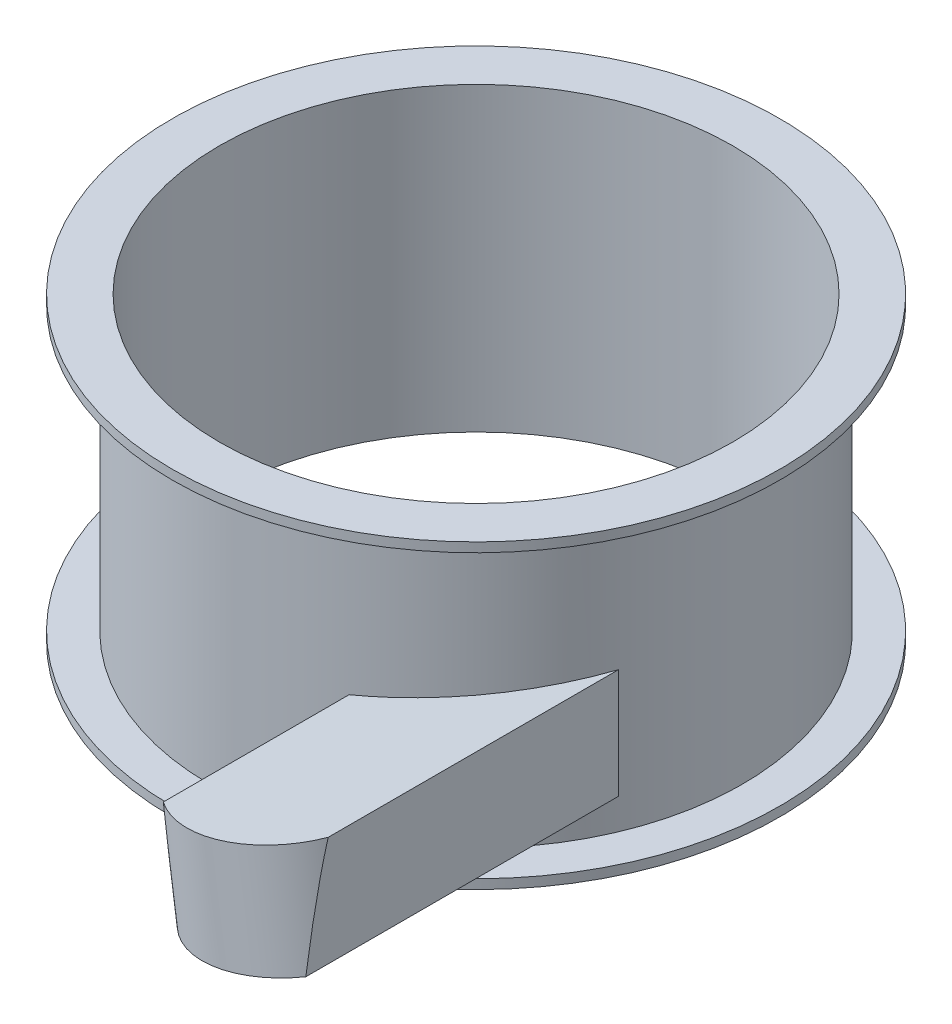
ISO-10303-21;
HEADER;
FILE_DESCRIPTION(('STEP AP214'),'2;1');
FILE_NAME('part.step','',(''),(''),'','','');
FILE_SCHEMA(('AUTOMOTIVE_DESIGN { 1 0 10303 214 1 1 1 1 }'));
ENDSEC;
DATA;
#1=APPLICATION_CONTEXT('core data for automotive mechanical design processes');
#2=APPLICATION_PROTOCOL_DEFINITION('international standard','automotive_design',2000,#1);
#3=PRODUCT_CONTEXT('',#1,'mechanical');
#4=PRODUCT('Part','Part','',(#3));
#5=PRODUCT_RELATED_PRODUCT_CATEGORY('part','',(#4));
#6=PRODUCT_DEFINITION_FORMATION('','',#4);
#7=PRODUCT_DEFINITION_CONTEXT('part definition',#1,'design');
#8=PRODUCT_DEFINITION('design','',#6,#7);
#9=PRODUCT_DEFINITION_SHAPE('','',#8);
#10=(LENGTH_UNIT() NAMED_UNIT(*) SI_UNIT(.MILLI.,.METRE.));
#11=(NAMED_UNIT(*) PLANE_ANGLE_UNIT() SI_UNIT($,.RADIAN.));
#12=(NAMED_UNIT(*) SI_UNIT($,.STERADIAN.) SOLID_ANGLE_UNIT());
#13=UNCERTAINTY_MEASURE_WITH_UNIT(LENGTH_MEASURE(1.E-05),#10,'distance_accuracy_value','');
#14=(GEOMETRIC_REPRESENTATION_CONTEXT(3) GLOBAL_UNCERTAINTY_ASSIGNED_CONTEXT((#13)) GLOBAL_UNIT_ASSIGNED_CONTEXT((#10,
#11,#12)) REPRESENTATION_CONTEXT('',''));
#15=CARTESIAN_POINT('',(0.,0.,0.));
#16=DIRECTION('',(0.,0.,1.));
#17=DIRECTION('',(1.,0.,0.));
#18=AXIS2_PLACEMENT_3D('',#15,#16,#17);
#19=CARTESIAN_POINT('',(271.787755102041,74.6313325330143,241.));
#20=DIRECTION('',(-1.,0.,0.));
#21=DIRECTION('',(0.,0.,1.));
#22=AXIS2_PLACEMENT_3D('',#19,#20,#21);
#23=PLANE('',#22);
#24=DIRECTION('',(0.,0.,-1.));
#25=VECTOR('',#24,1.);
#26=CARTESIAN_POINT('',(271.787755102041,74.6313325330143,241.));
#27=LINE('',#26,#25);
#28=CARTESIAN_POINT('',(271.787755102041,74.6313325330142,208.968468170204));
#29=VERTEX_POINT('',#28);
#30=CARTESIAN_POINT('',(271.787755102041,74.6313325330143,54.7082564102552));
#31=VERTEX_POINT('',#30);
#32=EDGE_CURVE('E165',#29,#31,#27,.T.);
#33=ORIENTED_EDGE('',*,*,#32,.F.);
#34=CARTESIAN_POINT('',(271.787755102041,-228.764700180287,188.343327465142));
#35=DIRECTION('',(-1.,0.,0.));
#36=DIRECTION('',(0.,-1.,0.));
#37=AXIS2_PLACEMENT_3D('',#34,#35,#36);
#38=ELLIPSE('',#37,336.964397029181,47.4027571613106);
#39=CARTESIAN_POINT('',(271.787755102041,16.3749099639866,220.867019893133));
#40=VERTEX_POINT('',#39);
#41=EDGE_CURVE('E156',#29,#40,#38,.F.);
#42=ORIENTED_EDGE('',*,*,#41,.T.);
#43=DIRECTION('',(0.,0.,-1.));
#44=VECTOR('',#43,1.);
#45=CARTESIAN_POINT('',(271.787755102041,16.3749099639866,241.));
#46=LINE('',#45,#44);
#47=CARTESIAN_POINT('',(271.787755102041,16.3749099639866,54.7082564102552));
#48=VERTEX_POINT('',#47);
#49=EDGE_CURVE('E159',#40,#48,#46,.T.);
#50=ORIENTED_EDGE('',*,*,#49,.T.);
#51=DIRECTION('',(0.,1.,0.));
#52=VECTOR('',#51,1.);
#53=CARTESIAN_POINT('',(271.787755102041,150.,54.7082564102554));
#54=LINE('',#53,#52);
#55=EDGE_CURVE('E194',#31,#48,#54,.F.);
#56=ORIENTED_EDGE('',*,*,#55,.F.);
#57=EDGE_LOOP('',(#33,#42,#50,#56));
#58=FACE_BOUND('',#57,.T.);
#59=ADVANCED_FACE('F39',(#58),#23,.F.);
#60=CARTESIAN_POINT('',(271.787755102041,74.6313325330143,241.));
#61=DIRECTION('',(0.140675862433044,-0.990055706376525,0.));
#62=DIRECTION('',(0.990055706376525,0.140675862433044,0.));
#63=AXIS2_PLACEMENT_3D('',#60,#61,#62);
#64=PLANE('',#63);
#65=DIRECTION('',(0.,0.,-1.));
#66=VECTOR('',#65,1.);
#67=CARTESIAN_POINT('',(201.787755102041,64.6851140456193,241.));
#68=LINE('',#67,#66);
#69=CARTESIAN_POINT('',(201.787755102041,64.6851140456193,226.576240328998));
#70=VERTEX_POINT('',#69);
#71=CARTESIAN_POINT('',(201.787755102041,64.6851140456193,127.856478262683));
#72=VERTEX_POINT('',#71);
#73=EDGE_CURVE('E163',#70,#72,#68,.T.);
#74=ORIENTED_EDGE('',*,*,#73,.F.);
#75=CARTESIAN_POINT('',(229.531683951017,68.6272165889144,188.343327465142));
#76=DIRECTION('',(0.140675862433044,-0.990055706376525,0.));
#77=DIRECTION('',(0.990055706376525,0.140675862433044,0.));
#78=AXIS2_PLACEMENT_3D('',#75,#76,#77);
#79=CIRCLE('',#78,47.4027571613106);
#80=EDGE_CURVE('E153',#70,#29,#79,.F.);
#81=ORIENTED_EDGE('',*,*,#80,.T.);
#82=ORIENTED_EDGE('',*,*,#32,.T.);
#83=CARTESIAN_POINT('',(141.4,56.104688242645,0.));
#84=DIRECTION('',(0.140675862433044,-0.990055706376525,0.));
#85=DIRECTION('',(0.990055706376525,0.140675862433044,0.));
#86=AXIS2_PLACEMENT_3D('',#83,#84,#85);
#87=ELLIPSE('',#86,142.820246466237,141.4);
#88=EDGE_CURVE('E191',#72,#31,#87,.F.);
#89=ORIENTED_EDGE('',*,*,#88,.F.);
#90=EDGE_LOOP('',(#74,#81,#82,#89));
#91=FACE_BOUND('',#90,.T.);
#92=ADVANCED_FACE('F259',(#91),#64,.F.);
#93=CARTESIAN_POINT('',(201.787755102041,6.42869147659168,241.));
#94=DIRECTION('',(1.,0.,0.));
#95=DIRECTION('',(0.,0.,-1.));
#96=AXIS2_PLACEMENT_3D('',#93,#94,#95);
#97=PLANE('',#96);
#98=DIRECTION('',(0.,0.,-1.));
#99=VECTOR('',#98,1.);
#100=CARTESIAN_POINT('',(201.787755102041,6.42869147659168,241.));
#101=LINE('',#100,#99);
#102=CARTESIAN_POINT('',(201.787755102041,6.42869147659166,218.925798780769));
#103=VERTEX_POINT('',#102);
#104=CARTESIAN_POINT('',(201.787755102041,6.42869147659168,127.856478262683));
#105=VERTEX_POINT('',#104);
#106=EDGE_CURVE('E161',#103,#105,#101,.T.);
#107=ORIENTED_EDGE('',*,*,#106,.F.);
#108=CARTESIAN_POINT('',(201.787755102041,263.884843584498,188.343327465142));
#109=DIRECTION('',(1.,0.,0.));
#110=DIRECTION('',(0.,-1.,0.));
#111=AXIS2_PLACEMENT_3D('',#108,#109,#110);
#112=ELLIPSE('',#111,336.964397029181,47.4027571613106);
#113=EDGE_CURVE('E150',#103,#70,#112,.F.);
#114=ORIENTED_EDGE('',*,*,#113,.T.);
#115=ORIENTED_EDGE('',*,*,#73,.T.);
#116=DIRECTION('',(0.,1.,0.));
#117=VECTOR('',#116,1.);
#118=CARTESIAN_POINT('',(201.787755102041,150.,127.856478262683));
#119=LINE('',#118,#117);
#120=EDGE_CURVE('E188',#105,#72,#119,.T.);
#121=ORIENTED_EDGE('',*,*,#120,.F.);
#122=EDGE_LOOP('',(#107,#114,#115,#121));
#123=FACE_BOUND('',#122,.T.);
#124=ADVANCED_FACE('F266',(#123),#97,.F.);
#125=CARTESIAN_POINT('',(271.787755102041,16.3749099639866,241.));
#126=DIRECTION('',(-0.140675862433044,0.990055706376525,0.));
#127=DIRECTION('',(-0.990055706376525,-0.140675862433044,0.));
#128=AXIS2_PLACEMENT_3D('',#125,#126,#127);
#129=PLANE('',#128);
#130=CARTESIAN_POINT('',(237.332267558593,11.4791698611746,195.244994694876));
#131=DIRECTION('',(-0.140675862433044,0.990055706376525,0.));
#132=DIRECTION('',(-0.990055706376525,-0.140675862433044,0.));
#133=AXIS2_PLACEMENT_3D('',#130,#131,#132);
#134=CIRCLE('',#133,28.146504222363);
#135=CARTESIAN_POINT('',(209.465660438692,7.51963610521836,195.244994694876));
#136=VERTEX_POINT('',#135);
#137=EDGE_CURVE('E149',#136,#136,#134,.F.);
#138=ORIENTED_EDGE('',*,*,#137,.F.);
#139=EDGE_LOOP('',(#138));
#140=FACE_BOUND('',#139,.T.);
#141=ORIENTED_EDGE('',*,*,#49,.F.);
#142=CARTESIAN_POINT('',(237.645460242242,11.5236710448921,188.343327465142));
#143=DIRECTION('',(-0.140675862433044,0.990055706376525,0.));
#144=DIRECTION('',(-0.990055706376525,-0.140675862433044,0.));
#145=AXIS2_PLACEMENT_3D('',#142,#143,#144);
#146=CIRCLE('',#145,47.4027571613106);
#147=EDGE_CURVE('E197',#40,#103,#146,.F.);
#148=ORIENTED_EDGE('',*,*,#147,.T.);
#149=ORIENTED_EDGE('',*,*,#106,.T.);
#150=CARTESIAN_POINT('',(141.4,-2.15173432638258,0.));
#151=DIRECTION('',(-0.140675862433044,0.990055706376525,0.));
#152=DIRECTION('',(0.990055706376525,0.140675862433044,0.));
#153=AXIS2_PLACEMENT_3D('',#150,#151,#152);
#154=ELLIPSE('',#153,142.820246466237,141.4);
#155=EDGE_CURVE('E185',#48,#105,#154,.F.);
#156=ORIENTED_EDGE('',*,*,#155,.F.);
#157=EDGE_LOOP('',(#141,#148,#149,#156));
#158=FACE_BOUND('',#157,.T.);
#159=ADVANCED_FACE('F273',(#140,#158),#129,.F.);
#160=CARTESIAN_POINT('',(141.4,150.,0.));
#161=DIRECTION('',(0.,1.,0.));
#162=DIRECTION('',(0.,0.,1.));
#163=AXIS2_PLACEMENT_3D('',#160,#161,#162);
#164=CYLINDRICAL_SURFACE('',#163,141.4);
#165=CARTESIAN_POINT('',(141.4,0.,0.));
#166=DIRECTION('',(0.,1.,0.));
#167=DIRECTION('',(0.,0.,1.));
#168=AXIS2_PLACEMENT_3D('',#165,#166,#167);
#169=CIRCLE('',#168,141.4);
#170=CARTESIAN_POINT('',(141.4,0.,141.4));
#171=VERTEX_POINT('',#170);
#172=EDGE_CURVE('E182',#171,#171,#169,.T.);
#173=ORIENTED_EDGE('',*,*,#172,.T.);
#174=EDGE_LOOP('',(#173));
#175=FACE_BOUND('',#174,.T.);
#176=CARTESIAN_POINT('',(141.4,150.,0.));
#177=DIRECTION('',(0.,1.,0.));
#178=DIRECTION('',(0.,0.,1.));
#179=AXIS2_PLACEMENT_3D('',#176,#177,#178);
#180=CIRCLE('',#179,141.4);
#181=CARTESIAN_POINT('',(141.4,150.,141.4));
#182=VERTEX_POINT('',#181);
#183=EDGE_CURVE('E167',#182,#182,#180,.T.);
#184=ORIENTED_EDGE('',*,*,#183,.F.);
#185=EDGE_LOOP('',(#184));
#186=FACE_BOUND('',#185,.T.);
#187=ORIENTED_EDGE('',*,*,#88,.T.);
#188=ORIENTED_EDGE('',*,*,#55,.T.);
#189=ORIENTED_EDGE('',*,*,#155,.T.);
#190=ORIENTED_EDGE('',*,*,#120,.T.);
#191=EDGE_LOOP('',(#187,#188,#189,#190));
#192=FACE_BOUND('',#191,.T.);
#193=ADVANCED_FACE('F41',(#175,#186,#192),#164,.T.);
#194=CARTESIAN_POINT('',(0.,0.,0.));
#195=DIRECTION('',(0.,1.,0.));
#196=DIRECTION('',(0.,0.,1.));
#197=AXIS2_PLACEMENT_3D('',#194,#195,#196);
#198=PLANE('',#197);
#199=CARTESIAN_POINT('',(141.4,0.,0.));
#200=DIRECTION('',(0.,1.,0.));
#201=DIRECTION('',(0.,0.,1.));
#202=AXIS2_PLACEMENT_3D('',#199,#200,#201);
#203=CIRCLE('',#202,161.4);
#204=CARTESIAN_POINT('',(141.4,0.,161.4));
#205=VERTEX_POINT('',#204);
#206=EDGE_CURVE('E179',#205,#205,#203,.T.);
#207=ORIENTED_EDGE('',*,*,#206,.T.);
#208=EDGE_LOOP('',(#207));
#209=FACE_BOUND('',#208,.T.);
#210=ORIENTED_EDGE('',*,*,#172,.F.);
#211=EDGE_LOOP('',(#210));
#212=FACE_BOUND('',#211,.T.);
#213=ADVANCED_FACE('F402',(#209,#212),#198,.T.);
#214=CARTESIAN_POINT('',(141.4,150.,0.));
#215=DIRECTION('',(0.,1.,0.));
#216=DIRECTION('',(0.,0.,1.));
#217=AXIS2_PLACEMENT_3D('',#214,#215,#216);
#218=CYLINDRICAL_SURFACE('',#217,161.4);
#219=CARTESIAN_POINT('',(141.4,-5.,0.));
#220=DIRECTION('',(0.,1.,0.));
#221=DIRECTION('',(0.,0.,1.));
#222=AXIS2_PLACEMENT_3D('',#219,#220,#221);
#223=CIRCLE('',#222,161.4);
#224=CARTESIAN_POINT('',(141.4,-5.,161.4));
#225=VERTEX_POINT('',#224);
#226=EDGE_CURVE('E176',#225,#225,#223,.T.);
#227=ORIENTED_EDGE('',*,*,#226,.T.);
#228=EDGE_LOOP('',(#227));
#229=FACE_BOUND('',#228,.T.);
#230=ORIENTED_EDGE('',*,*,#206,.F.);
#231=EDGE_LOOP('',(#230));
#232=FACE_BOUND('',#231,.T.);
#233=ADVANCED_FACE('F335',(#229,#232),#218,.T.);
#234=CARTESIAN_POINT('',(5.,-5.,0.));
#235=DIRECTION('',(0.,-1.,0.));
#236=DIRECTION('',(0.,0.,-1.));
#237=AXIS2_PLACEMENT_3D('',#234,#235,#236);
#238=PLANE('',#237);
#239=CARTESIAN_POINT('',(141.4,-5.,0.));
#240=DIRECTION('',(0.,1.,0.));
#241=DIRECTION('',(0.,0.,1.));
#242=AXIS2_PLACEMENT_3D('',#239,#240,#241);
#243=CIRCLE('',#242,136.4);
#244=CARTESIAN_POINT('',(141.4,-5.,136.4));
#245=VERTEX_POINT('',#244);
#246=EDGE_CURVE('E231',#245,#245,#243,.T.);
#247=ORIENTED_EDGE('',*,*,#246,.T.);
#248=EDGE_LOOP('',(#247));
#249=FACE_BOUND('',#248,.T.);
#250=ORIENTED_EDGE('',*,*,#226,.F.);
#251=EDGE_LOOP('',(#250));
#252=FACE_BOUND('',#251,.T.);
#253=ADVANCED_FACE('F243',(#249,#252),#238,.T.);
#254=CARTESIAN_POINT('',(-20.,155.,0.));
#255=DIRECTION('',(0.,1.,0.));
#256=DIRECTION('',(0.,0.,1.));
#257=AXIS2_PLACEMENT_3D('',#254,#255,#256);
#258=PLANE('',#257);
#259=CARTESIAN_POINT('',(141.4,155.,0.));
#260=DIRECTION('',(0.,1.,0.));
#261=DIRECTION('',(0.,0.,1.));
#262=AXIS2_PLACEMENT_3D('',#259,#260,#261);
#263=CIRCLE('',#262,136.4);
#264=CARTESIAN_POINT('',(141.4,155.,136.4));
#265=VERTEX_POINT('',#264);
#266=EDGE_CURVE('E234',#265,#265,#263,.T.);
#267=ORIENTED_EDGE('',*,*,#266,.F.);
#268=EDGE_LOOP('',(#267));
#269=FACE_BOUND('',#268,.T.);
#270=CARTESIAN_POINT('',(141.4,155.,0.));
#271=DIRECTION('',(0.,1.,0.));
#272=DIRECTION('',(0.,0.,1.));
#273=AXIS2_PLACEMENT_3D('',#270,#271,#272);
#274=CIRCLE('',#273,161.4);
#275=CARTESIAN_POINT('',(141.4,155.,161.4));
#276=VERTEX_POINT('',#275);
#277=EDGE_CURVE('E173',#276,#276,#274,.T.);
#278=ORIENTED_EDGE('',*,*,#277,.T.);
#279=EDGE_LOOP('',(#278));
#280=FACE_BOUND('',#279,.T.);
#281=ADVANCED_FACE('F239',(#269,#280),#258,.T.);
#282=CARTESIAN_POINT('',(141.4,150.,0.));
#283=DIRECTION('',(0.,1.,0.));
#284=DIRECTION('',(0.,0.,1.));
#285=AXIS2_PLACEMENT_3D('',#282,#283,#284);
#286=CYLINDRICAL_SURFACE('',#285,161.4);
#287=CARTESIAN_POINT('',(141.4,150.,0.));
#288=DIRECTION('',(0.,1.,0.));
#289=DIRECTION('',(0.,0.,1.));
#290=AXIS2_PLACEMENT_3D('',#287,#288,#289);
#291=CIRCLE('',#290,161.4);
#292=CARTESIAN_POINT('',(141.4,150.,161.4));
#293=VERTEX_POINT('',#292);
#294=EDGE_CURVE('E170',#293,#293,#291,.T.);
#295=ORIENTED_EDGE('',*,*,#294,.T.);
#296=EDGE_LOOP('',(#295));
#297=FACE_BOUND('',#296,.T.);
#298=ORIENTED_EDGE('',*,*,#277,.F.);
#299=EDGE_LOOP('',(#298));
#300=FACE_BOUND('',#299,.T.);
#301=ADVANCED_FACE('F242',(#297,#300),#286,.T.);
#302=CARTESIAN_POINT('',(0.,150.,0.));
#303=DIRECTION('',(0.,-1.,0.));
#304=DIRECTION('',(0.,0.,-1.));
#305=AXIS2_PLACEMENT_3D('',#302,#303,#304);
#306=PLANE('',#305);
#307=ORIENTED_EDGE('',*,*,#183,.T.);
#308=EDGE_LOOP('',(#307));
#309=FACE_BOUND('',#308,.T.);
#310=ORIENTED_EDGE('',*,*,#294,.F.);
#311=EDGE_LOOP('',(#310));
#312=FACE_BOUND('',#311,.T.);
#313=ADVANCED_FACE('F248',(#309,#312),#306,.T.);
#314=CARTESIAN_POINT('',(212.563790213383,188.044718138843,188.343327465142));
#315=DIRECTION('',(0.140675862433044,-0.990055706376525,0.));
#316=DIRECTION('',(0.990055706376525,0.140675862433044,0.));
#317=AXIS2_PLACEMENT_3D('',#314,#315,#316);
#318=CYLINDRICAL_SURFACE('',#317,47.4027571613106);
#319=ORIENTED_EDGE('',*,*,#80,.F.);
#320=ORIENTED_EDGE('',*,*,#113,.F.);
#321=ORIENTED_EDGE('',*,*,#147,.F.);
#322=ORIENTED_EDGE('',*,*,#41,.F.);
#323=EDGE_LOOP('',(#319,#320,#321,#322));
#324=FACE_BOUND('',#323,.T.);
#325=ADVANCED_FACE('F255',(#324),#318,.T.);
#326=CARTESIAN_POINT('',(240.923022587907,-13.7920276668611,195.244994694876));
#327=DIRECTION('',(-0.140675862433044,0.990055706376525,0.));
#328=DIRECTION('',(-0.990055706376525,-0.140675862433044,0.));
#329=AXIS2_PLACEMENT_3D('',#326,#327,#328);
#330=CYLINDRICAL_SURFACE('',#329,28.146504222363);
#331=DIRECTION('',(-0.140675862433044,0.990055706376525,0.));
#332=VECTOR('',#331,1.);
#333=CARTESIAN_POINT('',(261.257905881687,-10.9026677789238,176.));
#334=LINE('',#333,#332);
#335=CARTESIAN_POINT('',(256.963771540208,19.3188082809946,176.));
#336=VERTEX_POINT('',#335);
#337=CARTESIAN_POINT('',(250.255657949378,66.52950971021,176.));
#338=VERTEX_POINT('',#337);
#339=EDGE_CURVE('E47',#336,#338,#334,.T.);
#340=ORIENTED_EDGE('',*,*,#339,.F.);
#341=CARTESIAN_POINT('',(236.628888246428,16.4294483930572,195.244994694876));
#342=DIRECTION('',(-0.140675862433044,0.990055706376525,0.));
#343=DIRECTION('',(-0.990055706376525,-0.140675862433044,0.));
#344=AXIS2_PLACEMENT_3D('',#341,#342,#343);
#345=CIRCLE('',#344,28.146504222363);
#346=CARTESIAN_POINT('',(216.294004952648,13.5400885051198,176.));
#347=VERTEX_POINT('',#346);
#348=EDGE_CURVE('E204',#336,#347,#345,.T.);
#349=ORIENTED_EDGE('',*,*,#348,.T.);
#350=DIRECTION('',(-0.140675862433044,0.990055706376525,0.));
#351=VECTOR('',#350,1.);
#352=CARTESIAN_POINT('',(220.588139294127,-16.6813875547985,176.));
#353=LINE('',#352,#351);
#354=CARTESIAN_POINT('',(209.576866215528,60.8143075657848,176.));
#355=VERTEX_POINT('',#354);
#356=EDGE_CURVE('E200',#355,#347,#353,.F.);
#357=ORIENTED_EDGE('',*,*,#356,.F.);
#358=CARTESIAN_POINT('',(229.916262082453,63.6719086379974,195.244994694876));
#359=DIRECTION('',(0.139129433730637,-0.99027420478865,0.));
#360=DIRECTION('',(-0.99027420478865,-0.139129433730637,0.));
#361=AXIS2_PLACEMENT_3D('',#358,#359,#360);
#362=ELLIPSE('',#361,28.1465385496462,28.146504222363);
#363=EDGE_CURVE('E207',#355,#338,#362,.T.);
#364=ORIENTED_EDGE('',*,*,#363,.T.);
#365=EDGE_LOOP('',(#340,#349,#357,#364));
#366=FACE_BOUND('',#365,.T.);
#367=CARTESIAN_POINT('',(229.735770987209,64.942178005507,195.244994694876));
#368=DIRECTION('',(0.140675862433044,-0.990055706376525,0.));
#369=DIRECTION('',(0.990055706376525,0.140675862433044,0.));
#370=AXIS2_PLACEMENT_3D('',#367,#368,#369);
#371=CIRCLE('',#370,28.146504222363);
#372=CARTESIAN_POINT('',(257.60237810711,68.9017117614633,195.244994694876));
#373=VERTEX_POINT('',#372);
#374=EDGE_CURVE('E146',#373,#373,#371,.T.);
#375=ORIENTED_EDGE('',*,*,#374,.F.);
#376=EDGE_LOOP('',(#375));
#377=FACE_BOUND('',#376,.T.);
#378=ORIENTED_EDGE('',*,*,#137,.T.);
#379=EDGE_LOOP('',(#378));
#380=FACE_BOUND('',#379,.T.);
#381=ADVANCED_FACE('F219',(#366,#377,#380),#330,.F.);
#382=CARTESIAN_POINT('',(229.735770987209,64.942178005507,195.244994694876));
#383=DIRECTION('',(0.140675862433044,-0.990055706376525,0.));
#384=DIRECTION('',(0.990055706376525,0.140675862433044,0.));
#385=AXIS2_PLACEMENT_3D('',#382,#383,#384);
#386=PLANE('',#385);
#387=ORIENTED_EDGE('',*,*,#374,.T.);
#388=EDGE_LOOP('',(#387));
#389=FACE_BOUND('',#388,.T.);
#390=ADVANCED_FACE('F283',(#389),#386,.T.);
#391=CARTESIAN_POINT('',(0.,0.,176.));
#392=DIRECTION('',(0.,0.,1.));
#393=DIRECTION('',(1.,0.,0.));
#394=AXIS2_PLACEMENT_3D('',#391,#392,#393);
#395=PLANE('',#394);
#396=ORIENTED_EDGE('',*,*,#339,.T.);
#397=DIRECTION('',(-0.990274204788649,-0.139129433730637,0.));
#398=VECTOR('',#397,1.);
#399=CARTESIAN_POINT('',(266.787755102041,68.8522010457081,176.));
#400=LINE('',#399,#398);
#401=CARTESIAN_POINT('',(266.787755102041,68.8522010457081,176.));
#402=VERTEX_POINT('',#401);
#403=EDGE_CURVE('E213',#402,#338,#400,.T.);
#404=ORIENTED_EDGE('',*,*,#403,.F.);
#405=DIRECTION('',(0.,1.,0.));
#406=VECTOR('',#405,1.);
#407=CARTESIAN_POINT('',(266.787755102041,20.7146866656026,176.));
#408=LINE('',#407,#406);
#409=CARTESIAN_POINT('',(266.787755102041,20.7146866656026,176.));
#410=VERTEX_POINT('',#409);
#411=EDGE_CURVE('E134',#410,#402,#408,.T.);
#412=ORIENTED_EDGE('',*,*,#411,.F.);
#413=DIRECTION('',(0.990055706376525,0.140675862433044,0.));
#414=VECTOR('',#413,1.);
#415=CARTESIAN_POINT('',(206.787755102041,12.1893565335498,176.));
#416=LINE('',#415,#414);
#417=EDGE_CURVE('E214',#336,#410,#416,.T.);
#418=ORIENTED_EDGE('',*,*,#417,.F.);
#419=EDGE_LOOP('',(#396,#404,#412,#418));
#420=FACE_BOUND('',#419,.T.);
#421=ADVANCED_FACE('F212',(#420),#395,.F.);
#422=CARTESIAN_POINT('',(266.787755102041,68.8522010457081,176.));
#423=DIRECTION('',(0.139129433730637,-0.99027420478865,0.));
#424=DIRECTION('',(0.99027420478865,0.139129433730637,0.));
#425=AXIS2_PLACEMENT_3D('',#422,#423,#424);
#426=PLANE('',#425);
#427=CARTESIAN_POINT('',(141.4,51.2357395850907,0.));
#428=DIRECTION('',(0.139129433730637,-0.99027420478865,0.));
#429=DIRECTION('',(0.99027420478865,0.139129433730637,0.));
#430=AXIS2_PLACEMENT_3D('',#427,#428,#429);
#431=ELLIPSE('',#430,137.739627408664,136.4);
#432=CARTESIAN_POINT('',(266.787755102041,68.8522010457081,53.6923725539359));
#433=VERTEX_POINT('',#432);
#434=CARTESIAN_POINT('',(206.787755102041,60.4224489795924,119.705478081479));
#435=VERTEX_POINT('',#434);
#436=EDGE_CURVE('E115',#433,#435,#431,.T.);
#437=ORIENTED_EDGE('',*,*,#436,.F.);
#438=DIRECTION('',(0.,0.,-1.));
#439=VECTOR('',#438,1.);
#440=CARTESIAN_POINT('',(266.787755102041,68.8522010457081,176.));
#441=LINE('',#440,#439);
#442=EDGE_CURVE('E126',#402,#433,#441,.T.);
#443=ORIENTED_EDGE('',*,*,#442,.F.);
#444=ORIENTED_EDGE('',*,*,#403,.T.);
#445=ORIENTED_EDGE('',*,*,#363,.F.);
#446=CARTESIAN_POINT('',(206.787755102041,60.4224489795924,176.));
#447=VERTEX_POINT('',#446);
#448=EDGE_CURVE('E61',#355,#447,#400,.T.);
#449=ORIENTED_EDGE('',*,*,#448,.T.);
#450=DIRECTION('',(0.,0.,-1.));
#451=VECTOR('',#450,1.);
#452=CARTESIAN_POINT('',(206.787755102041,60.4224489795924,176.));
#453=LINE('',#452,#451);
#454=EDGE_CURVE('E129',#447,#435,#453,.T.);
#455=ORIENTED_EDGE('',*,*,#454,.T.);
#456=EDGE_LOOP('',(#437,#443,#444,#445,#449,#455));
#457=FACE_BOUND('',#456,.T.);
#458=ADVANCED_FACE('F124',(#457),#426,.T.);
#459=CARTESIAN_POINT('',(206.787755102041,60.4224489795924,176.));
#460=DIRECTION('',(1.,0.,0.));
#461=DIRECTION('',(0.,0.,-1.));
#462=AXIS2_PLACEMENT_3D('',#459,#460,#461);
#463=PLANE('',#462);
#464=DIRECTION('',(0.,1.,0.));
#465=VECTOR('',#464,1.);
#466=CARTESIAN_POINT('',(206.787755102041,-5.,119.705478081479));
#467=LINE('',#466,#465);
#468=CARTESIAN_POINT('',(206.787755102041,12.1893565335498,119.705478081479));
#469=VERTEX_POINT('',#468);
#470=EDGE_CURVE('E130',#435,#469,#467,.F.);
#471=ORIENTED_EDGE('',*,*,#470,.F.);
#472=ORIENTED_EDGE('',*,*,#454,.F.);
#473=DIRECTION('',(0.,-1.,0.));
#474=VECTOR('',#473,1.);
#475=CARTESIAN_POINT('',(206.787755102041,60.4224489795924,176.));
#476=LINE('',#475,#474);
#477=CARTESIAN_POINT('',(206.787755102041,12.1893565335498,176.));
#478=VERTEX_POINT('',#477);
#479=EDGE_CURVE('E217',#447,#478,#476,.T.);
#480=ORIENTED_EDGE('',*,*,#479,.T.);
#481=DIRECTION('',(0.,0.,-1.));
#482=VECTOR('',#481,1.);
#483=CARTESIAN_POINT('',(206.787755102041,12.1893565335498,176.));
#484=LINE('',#483,#482);
#485=EDGE_CURVE('E137',#478,#469,#484,.T.);
#486=ORIENTED_EDGE('',*,*,#485,.T.);
#487=EDGE_LOOP('',(#471,#472,#480,#486));
#488=FACE_BOUND('',#487,.T.);
#489=ADVANCED_FACE('F289',(#488),#463,.T.);
#490=CARTESIAN_POINT('',(206.787755102041,12.1893565335498,176.));
#491=DIRECTION('',(-0.140675862433044,0.990055706376525,0.));
#492=DIRECTION('',(-0.990055706376525,-0.140675862433044,0.));
#493=AXIS2_PLACEMENT_3D('',#490,#491,#492);
#494=PLANE('',#493);
#495=CARTESIAN_POINT('',(141.4,2.89848655290445,0.));
#496=DIRECTION('',(-0.140675862433044,0.990055706376525,0.));
#497=DIRECTION('',(0.990055706376525,0.140675862433044,0.));
#498=AXIS2_PLACEMENT_3D('',#495,#496,#497);
#499=ELLIPSE('',#498,137.77002558695,136.4);
#500=CARTESIAN_POINT('',(266.787755102041,20.7146866656026,53.6923725539359));
#501=VERTEX_POINT('',#500);
#502=EDGE_CURVE('E53',#469,#501,#499,.T.);
#503=ORIENTED_EDGE('',*,*,#502,.F.);
#504=ORIENTED_EDGE('',*,*,#485,.F.);
#505=EDGE_CURVE('E139',#478,#347,#416,.T.);
#506=ORIENTED_EDGE('',*,*,#505,.T.);
#507=ORIENTED_EDGE('',*,*,#348,.F.);
#508=ORIENTED_EDGE('',*,*,#417,.T.);
#509=DIRECTION('',(0.,0.,-1.));
#510=VECTOR('',#509,1.);
#511=CARTESIAN_POINT('',(266.787755102041,20.7146866656026,176.));
#512=LINE('',#511,#510);
#513=EDGE_CURVE('E135',#410,#501,#512,.T.);
#514=ORIENTED_EDGE('',*,*,#513,.T.);
#515=EDGE_LOOP('',(#503,#504,#506,#507,#508,#514));
#516=FACE_BOUND('',#515,.T.);
#517=ADVANCED_FACE('F226',(#516),#494,.T.);
#518=CARTESIAN_POINT('',(266.787755102041,20.7146866656026,176.));
#519=DIRECTION('',(-1.,0.,0.));
#520=DIRECTION('',(0.,0.,1.));
#521=AXIS2_PLACEMENT_3D('',#518,#519,#520);
#522=PLANE('',#521);
#523=DIRECTION('',(0.,1.,0.));
#524=VECTOR('',#523,1.);
#525=CARTESIAN_POINT('',(266.787755102041,-5.,53.6923725539359));
#526=LINE('',#525,#524);
#527=EDGE_CURVE('E11',#501,#433,#526,.T.);
#528=ORIENTED_EDGE('',*,*,#527,.F.);
#529=ORIENTED_EDGE('',*,*,#513,.F.);
#530=ORIENTED_EDGE('',*,*,#411,.T.);
#531=ORIENTED_EDGE('',*,*,#442,.T.);
#532=EDGE_LOOP('',(#528,#529,#530,#531));
#533=FACE_BOUND('',#532,.T.);
#534=ADVANCED_FACE('F132',(#533),#522,.T.);
#535=ORIENTED_EDGE('',*,*,#356,.T.);
#536=ORIENTED_EDGE('',*,*,#505,.F.);
#537=ORIENTED_EDGE('',*,*,#479,.F.);
#538=ORIENTED_EDGE('',*,*,#448,.F.);
#539=EDGE_LOOP('',(#535,#536,#537,#538));
#540=FACE_BOUND('',#539,.T.);
#541=ADVANCED_FACE('F223',(#540),#395,.F.);
#542=CARTESIAN_POINT('',(141.4,-5.,0.));
#543=DIRECTION('',(0.,1.,0.));
#544=DIRECTION('',(0.,0.,1.));
#545=AXIS2_PLACEMENT_3D('',#542,#543,#544);
#546=CYLINDRICAL_SURFACE('',#545,136.4);
#547=ORIENTED_EDGE('',*,*,#436,.T.);
#548=ORIENTED_EDGE('',*,*,#470,.T.);
#549=ORIENTED_EDGE('',*,*,#502,.T.);
#550=ORIENTED_EDGE('',*,*,#527,.T.);
#551=EDGE_LOOP('',(#547,#548,#549,#550));
#552=FACE_BOUND('',#551,.T.);
#553=ORIENTED_EDGE('',*,*,#246,.F.);
#554=EDGE_LOOP('',(#553));
#555=FACE_BOUND('',#554,.T.);
#556=ORIENTED_EDGE('',*,*,#266,.T.);
#557=EDGE_LOOP('',(#556));
#558=FACE_BOUND('',#557,.T.);
#559=ADVANCED_FACE('F113',(#552,#555,#558),#546,.F.);
#560=CLOSED_SHELL('',(#59,#92,#124,#159,#193,#213,#233,#253,#281,#301,#313,#325,#381,#390,#421,
#458,#489,#517,#534,#541,#559));
#561=MANIFOLD_SOLID_BREP('B2',#560);
#562=ADVANCED_BREP_SHAPE_REPRESENTATION('',(#18,#561),#14);
#563=SHAPE_DEFINITION_REPRESENTATION(#9,#562);
ENDSEC;
END-ISO-10303-21;
